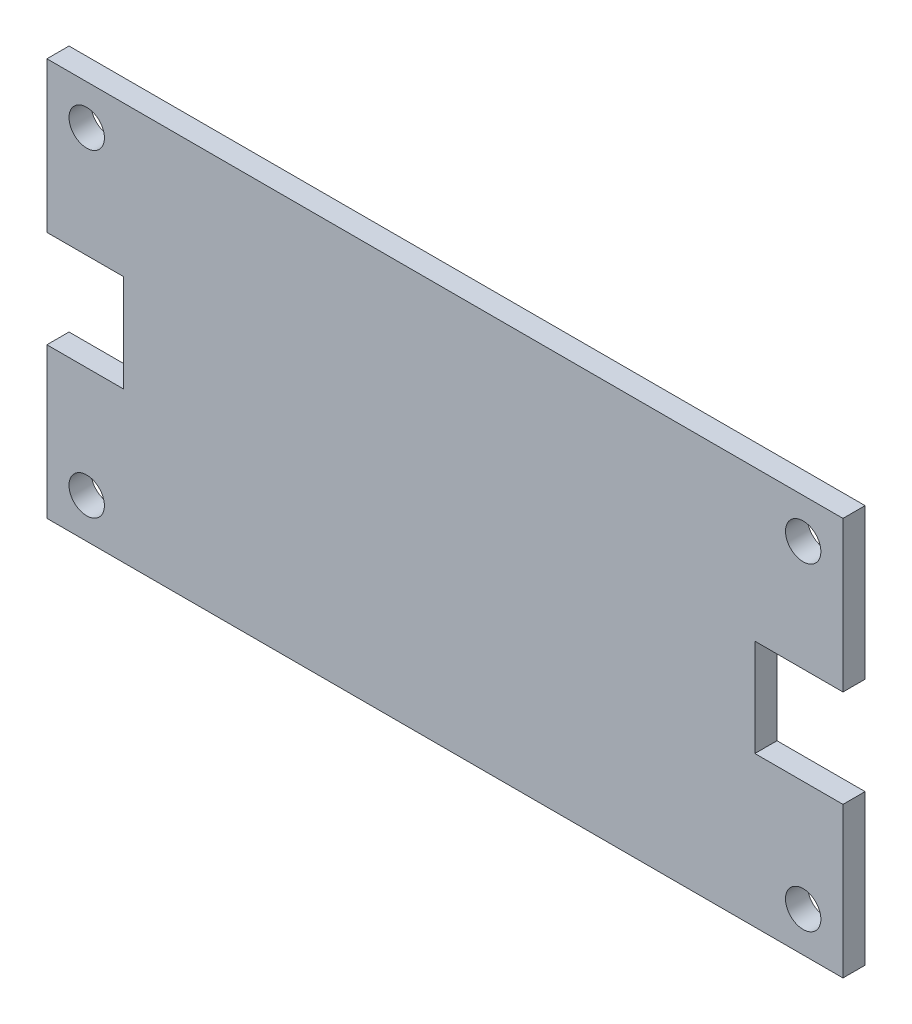
ISO-10303-21;
HEADER;
FILE_DESCRIPTION(('STEP AP214'),'2;1');
FILE_NAME('part.step','',(''),(''),'','','');
FILE_SCHEMA(('AUTOMOTIVE_DESIGN { 1 0 10303 214 1 1 1 1 }'));
ENDSEC;
DATA;
#1=APPLICATION_CONTEXT('core data for automotive mechanical design processes');
#2=APPLICATION_PROTOCOL_DEFINITION('international standard','automotive_design',2000,#1);
#3=PRODUCT_CONTEXT('',#1,'mechanical');
#4=PRODUCT('Part','Part','',(#3));
#5=PRODUCT_RELATED_PRODUCT_CATEGORY('part','',(#4));
#6=PRODUCT_DEFINITION_FORMATION('','',#4);
#7=PRODUCT_DEFINITION_CONTEXT('part definition',#1,'design');
#8=PRODUCT_DEFINITION('design','',#6,#7);
#9=PRODUCT_DEFINITION_SHAPE('','',#8);
#10=(LENGTH_UNIT() NAMED_UNIT(*) SI_UNIT(.MILLI.,.METRE.));
#11=(NAMED_UNIT(*) PLANE_ANGLE_UNIT() SI_UNIT($,.RADIAN.));
#12=(NAMED_UNIT(*) SI_UNIT($,.STERADIAN.) SOLID_ANGLE_UNIT());
#13=UNCERTAINTY_MEASURE_WITH_UNIT(LENGTH_MEASURE(1.E-05),#10,'distance_accuracy_value','');
#14=(GEOMETRIC_REPRESENTATION_CONTEXT(3) GLOBAL_UNCERTAINTY_ASSIGNED_CONTEXT((#13)) GLOBAL_UNIT_ASSIGNED_CONTEXT((#10,
#11,#12)) REPRESENTATION_CONTEXT('',''));
#15=CARTESIAN_POINT('',(0.,0.,0.));
#16=DIRECTION('',(0.,0.,1.));
#17=DIRECTION('',(1.,0.,0.));
#18=AXIS2_PLACEMENT_3D('',#15,#16,#17);
#19=CARTESIAN_POINT('',(90.,45.,5.));
#20=DIRECTION('',(-1.,0.,0.));
#21=DIRECTION('',(0.,0.,1.));
#22=AXIS2_PLACEMENT_3D('',#19,#20,#21);
#23=PLANE('',#22);
#24=DIRECTION('',(0.,1.,0.));
#25=VECTOR('',#24,1.);
#26=CARTESIAN_POINT('',(90.,45.,5.));
#27=LINE('',#26,#25);
#28=CARTESIAN_POINT('',(90.,11.,5.));
#29=VERTEX_POINT('',#28);
#30=CARTESIAN_POINT('',(90.,45.,5.));
#31=VERTEX_POINT('',#30);
#32=EDGE_CURVE('E319',#29,#31,#27,.T.);
#33=ORIENTED_EDGE('',*,*,#32,.F.);
#34=DIRECTION('',(0.,0.,-1.));
#35=VECTOR('',#34,1.);
#36=CARTESIAN_POINT('',(90.,11.,5.));
#37=LINE('',#36,#35);
#38=CARTESIAN_POINT('',(90.,11.,0.));
#39=VERTEX_POINT('',#38);
#40=EDGE_CURVE('E298',#29,#39,#37,.T.);
#41=ORIENTED_EDGE('',*,*,#40,.T.);
#42=DIRECTION('',(0.,1.,0.));
#43=VECTOR('',#42,1.);
#44=CARTESIAN_POINT('',(90.,45.,0.));
#45=LINE('',#44,#43);
#46=CARTESIAN_POINT('',(90.,45.,0.));
#47=VERTEX_POINT('',#46);
#48=EDGE_CURVE('E301',#39,#47,#45,.T.);
#49=ORIENTED_EDGE('',*,*,#48,.T.);
#50=DIRECTION('',(0.,0.,-1.));
#51=VECTOR('',#50,1.);
#52=CARTESIAN_POINT('',(90.,45.,5.));
#53=LINE('',#52,#51);
#54=EDGE_CURVE('E11',#31,#47,#53,.T.);
#55=ORIENTED_EDGE('',*,*,#54,.F.);
#56=EDGE_LOOP('',(#33,#41,#49,#55));
#57=FACE_BOUND('',#56,.T.);
#58=ADVANCED_FACE('F33',(#57),#23,.F.);
#59=CARTESIAN_POINT('',(-90.,45.,5.));
#60=DIRECTION('',(1.,0.,0.));
#61=DIRECTION('',(0.,0.,-1.));
#62=AXIS2_PLACEMENT_3D('',#59,#60,#61);
#63=PLANE('',#62);
#64=DIRECTION('',(0.,-1.,0.));
#65=VECTOR('',#64,1.);
#66=CARTESIAN_POINT('',(-90.,45.,5.));
#67=LINE('',#66,#65);
#68=CARTESIAN_POINT('',(-90.,-11.,5.));
#69=VERTEX_POINT('',#68);
#70=CARTESIAN_POINT('',(-90.,-45.,5.));
#71=VERTEX_POINT('',#70);
#72=EDGE_CURVE('E321',#69,#71,#67,.T.);
#73=ORIENTED_EDGE('',*,*,#72,.F.);
#74=DIRECTION('',(0.,0.,-1.));
#75=VECTOR('',#74,1.);
#76=CARTESIAN_POINT('',(-90.,-11.,5.));
#77=LINE('',#76,#75);
#78=CARTESIAN_POINT('',(-90.,-11.,0.));
#79=VERTEX_POINT('',#78);
#80=EDGE_CURVE('E296',#69,#79,#77,.T.);
#81=ORIENTED_EDGE('',*,*,#80,.T.);
#82=DIRECTION('',(0.,-1.,0.));
#83=VECTOR('',#82,1.);
#84=CARTESIAN_POINT('',(-90.,45.,0.));
#85=LINE('',#84,#83);
#86=CARTESIAN_POINT('',(-90.,-45.,0.));
#87=VERTEX_POINT('',#86);
#88=EDGE_CURVE('E333',#79,#87,#85,.T.);
#89=ORIENTED_EDGE('',*,*,#88,.T.);
#90=DIRECTION('',(0.,0.,-1.));
#91=VECTOR('',#90,1.);
#92=CARTESIAN_POINT('',(-90.,-45.,5.));
#93=LINE('',#92,#91);
#94=EDGE_CURVE('E341',#71,#87,#93,.T.);
#95=ORIENTED_EDGE('',*,*,#94,.F.);
#96=EDGE_LOOP('',(#73,#81,#89,#95));
#97=FACE_BOUND('',#96,.T.);
#98=ADVANCED_FACE('F395',(#97),#63,.F.);
#99=CARTESIAN_POINT('',(90.,-45.,0.));
#100=VERTEX_POINT('',#99);
#101=CARTESIAN_POINT('',(90.,-11.,0.));
#102=VERTEX_POINT('',#101);
#103=EDGE_CURVE('E328',#100,#102,#45,.T.);
#104=ORIENTED_EDGE('',*,*,#103,.T.);
#105=DIRECTION('',(0.,0.,-1.));
#106=VECTOR('',#105,1.);
#107=CARTESIAN_POINT('',(90.,-11.,5.));
#108=LINE('',#107,#106);
#109=CARTESIAN_POINT('',(90.,-11.,5.));
#110=VERTEX_POINT('',#109);
#111=EDGE_CURVE('E293',#110,#102,#108,.T.);
#112=ORIENTED_EDGE('',*,*,#111,.F.);
#113=CARTESIAN_POINT('',(90.,-45.,5.));
#114=VERTEX_POINT('',#113);
#115=EDGE_CURVE('E315',#114,#110,#27,.T.);
#116=ORIENTED_EDGE('',*,*,#115,.F.);
#117=DIRECTION('',(0.,0.,-1.));
#118=VECTOR('',#117,1.);
#119=CARTESIAN_POINT('',(90.,-45.,5.));
#120=LINE('',#119,#118);
#121=EDGE_CURVE('E327',#114,#100,#120,.T.);
#122=ORIENTED_EDGE('',*,*,#121,.T.);
#123=EDGE_LOOP('',(#104,#112,#116,#122));
#124=FACE_BOUND('',#123,.T.);
#125=ADVANCED_FACE('F35',(#124),#23,.F.);
#126=CARTESIAN_POINT('',(-90.,45.,5.));
#127=DIRECTION('',(0.,-1.,0.));
#128=DIRECTION('',(0.,0.,-1.));
#129=AXIS2_PLACEMENT_3D('',#126,#127,#128);
#130=PLANE('',#129);
#131=DIRECTION('',(-1.,0.,0.));
#132=VECTOR('',#131,1.);
#133=CARTESIAN_POINT('',(-90.,45.,0.));
#134=LINE('',#133,#132);
#135=CARTESIAN_POINT('',(-90.,45.,0.));
#136=VERTEX_POINT('',#135);
#137=EDGE_CURVE('E331',#47,#136,#134,.T.);
#138=ORIENTED_EDGE('',*,*,#137,.T.);
#139=DIRECTION('',(0.,0.,-1.));
#140=VECTOR('',#139,1.);
#141=CARTESIAN_POINT('',(-90.,45.,5.));
#142=LINE('',#141,#140);
#143=CARTESIAN_POINT('',(-90.,45.,5.));
#144=VERTEX_POINT('',#143);
#145=EDGE_CURVE('E41',#144,#136,#142,.T.);
#146=ORIENTED_EDGE('',*,*,#145,.F.);
#147=DIRECTION('',(-1.,0.,0.));
#148=VECTOR('',#147,1.);
#149=CARTESIAN_POINT('',(-90.,45.,5.));
#150=LINE('',#149,#148);
#151=EDGE_CURVE('E318',#31,#144,#150,.T.);
#152=ORIENTED_EDGE('',*,*,#151,.F.);
#153=ORIENTED_EDGE('',*,*,#54,.T.);
#154=EDGE_LOOP('',(#138,#146,#152,#153));
#155=FACE_BOUND('',#154,.T.);
#156=ADVANCED_FACE('F370',(#155),#130,.F.);
#157=CARTESIAN_POINT('',(-90.,11.,0.));
#158=VERTEX_POINT('',#157);
#159=EDGE_CURVE('E334',#136,#158,#85,.T.);
#160=ORIENTED_EDGE('',*,*,#159,.T.);
#161=DIRECTION('',(0.,0.,-1.));
#162=VECTOR('',#161,1.);
#163=CARTESIAN_POINT('',(-90.,11.,5.));
#164=LINE('',#163,#162);
#165=CARTESIAN_POINT('',(-90.,11.,5.));
#166=VERTEX_POINT('',#165);
#167=EDGE_CURVE('E309',#166,#158,#164,.T.);
#168=ORIENTED_EDGE('',*,*,#167,.F.);
#169=EDGE_CURVE('E322',#144,#166,#67,.T.);
#170=ORIENTED_EDGE('',*,*,#169,.F.);
#171=ORIENTED_EDGE('',*,*,#145,.T.);
#172=EDGE_LOOP('',(#160,#168,#170,#171));
#173=FACE_BOUND('',#172,.T.);
#174=ADVANCED_FACE('F348',(#173),#63,.F.);
#175=CARTESIAN_POINT('',(-90.,-45.,5.));
#176=DIRECTION('',(0.,1.,0.));
#177=DIRECTION('',(0.,0.,1.));
#178=AXIS2_PLACEMENT_3D('',#175,#176,#177);
#179=PLANE('',#178);
#180=DIRECTION('',(1.,0.,0.));
#181=VECTOR('',#180,1.);
#182=CARTESIAN_POINT('',(-90.,-45.,0.));
#183=LINE('',#182,#181);
#184=EDGE_CURVE('E337',#87,#100,#183,.T.);
#185=ORIENTED_EDGE('',*,*,#184,.T.);
#186=ORIENTED_EDGE('',*,*,#121,.F.);
#187=DIRECTION('',(1.,0.,0.));
#188=VECTOR('',#187,1.);
#189=CARTESIAN_POINT('',(-90.,-45.,5.));
#190=LINE('',#189,#188);
#191=EDGE_CURVE('E325',#71,#114,#190,.T.);
#192=ORIENTED_EDGE('',*,*,#191,.F.);
#193=ORIENTED_EDGE('',*,*,#94,.T.);
#194=EDGE_LOOP('',(#185,#186,#192,#193));
#195=FACE_BOUND('',#194,.T.);
#196=ADVANCED_FACE('F391',(#195),#179,.F.);
#197=CARTESIAN_POINT('',(0.,0.,5.));
#198=DIRECTION('',(0.,0.,1.));
#199=DIRECTION('',(1.,0.,0.));
#200=AXIS2_PLACEMENT_3D('',#197,#198,#199);
#201=PLANE('',#200);
#202=CARTESIAN_POINT('',(81.,-36.,5.));
#203=DIRECTION('',(0.,0.,-1.));
#204=DIRECTION('',(1.,0.,0.));
#205=AXIS2_PLACEMENT_3D('',#202,#203,#204);
#206=CIRCLE('',#205,4.00000000000001);
#207=CARTESIAN_POINT('',(85.,-36.,5.));
#208=VERTEX_POINT('',#207);
#209=EDGE_CURVE('E252',#208,#208,#206,.T.);
#210=ORIENTED_EDGE('',*,*,#209,.T.);
#211=EDGE_LOOP('',(#210));
#212=FACE_BOUND('',#211,.T.);
#213=CARTESIAN_POINT('',(-81.,-36.,5.));
#214=DIRECTION('',(0.,0.,-1.));
#215=DIRECTION('',(-1.,0.,0.));
#216=AXIS2_PLACEMENT_3D('',#213,#214,#215);
#217=CIRCLE('',#216,4.00000000000001);
#218=CARTESIAN_POINT('',(-85.,-36.,5.));
#219=VERTEX_POINT('',#218);
#220=EDGE_CURVE('E246',#219,#219,#217,.T.);
#221=ORIENTED_EDGE('',*,*,#220,.T.);
#222=EDGE_LOOP('',(#221));
#223=FACE_BOUND('',#222,.T.);
#224=CARTESIAN_POINT('',(-81.,36.,5.));
#225=DIRECTION('',(0.,0.,-1.));
#226=DIRECTION('',(1.,0.,0.));
#227=AXIS2_PLACEMENT_3D('',#224,#225,#226);
#228=CIRCLE('',#227,4.00000000000001);
#229=CARTESIAN_POINT('',(-77.,36.,5.));
#230=VERTEX_POINT('',#229);
#231=EDGE_CURVE('E239',#230,#230,#228,.T.);
#232=ORIENTED_EDGE('',*,*,#231,.T.);
#233=EDGE_LOOP('',(#232));
#234=FACE_BOUND('',#233,.T.);
#235=CARTESIAN_POINT('',(81.,36.,5.));
#236=DIRECTION('',(0.,0.,-1.));
#237=DIRECTION('',(-1.,0.,0.));
#238=AXIS2_PLACEMENT_3D('',#235,#236,#237);
#239=CIRCLE('',#238,4.00000000000001);
#240=CARTESIAN_POINT('',(77.,36.,5.));
#241=VERTEX_POINT('',#240);
#242=EDGE_CURVE('E257',#241,#241,#239,.T.);
#243=ORIENTED_EDGE('',*,*,#242,.T.);
#244=EDGE_LOOP('',(#243));
#245=FACE_BOUND('',#244,.T.);
#246=DIRECTION('',(0.,1.,0.));
#247=VECTOR('',#246,1.);
#248=CARTESIAN_POINT('',(70.0824005737011,11.,5.));
#249=LINE('',#248,#247);
#250=CARTESIAN_POINT('',(70.0824005737011,-11.,5.));
#251=VERTEX_POINT('',#250);
#252=CARTESIAN_POINT('',(70.0824005737011,11.,5.));
#253=VERTEX_POINT('',#252);
#254=EDGE_CURVE('E263',#251,#253,#249,.T.);
#255=ORIENTED_EDGE('',*,*,#254,.T.);
#256=DIRECTION('',(1.,0.,0.));
#257=VECTOR('',#256,1.);
#258=CARTESIAN_POINT('',(90.,11.,5.));
#259=LINE('',#258,#257);
#260=EDGE_CURVE('E289',#253,#29,#259,.T.);
#261=ORIENTED_EDGE('',*,*,#260,.T.);
#262=ORIENTED_EDGE('',*,*,#32,.T.);
#263=ORIENTED_EDGE('',*,*,#151,.T.);
#264=ORIENTED_EDGE('',*,*,#169,.T.);
#265=DIRECTION('',(1.,0.,0.));
#266=VECTOR('',#265,1.);
#267=CARTESIAN_POINT('',(-90.,11.,5.));
#268=LINE('',#267,#266);
#269=CARTESIAN_POINT('',(-72.7353338114177,11.,5.));
#270=VERTEX_POINT('',#269);
#271=EDGE_CURVE('E303',#166,#270,#268,.T.);
#272=ORIENTED_EDGE('',*,*,#271,.T.);
#273=DIRECTION('',(0.,-1.,0.));
#274=VECTOR('',#273,1.);
#275=CARTESIAN_POINT('',(-72.7353338114177,11.,5.));
#276=LINE('',#275,#274);
#277=CARTESIAN_POINT('',(-72.7353338114177,-11.,5.));
#278=VERTEX_POINT('',#277);
#279=EDGE_CURVE('E277',#270,#278,#276,.T.);
#280=ORIENTED_EDGE('',*,*,#279,.T.);
#281=DIRECTION('',(-1.,0.,0.));
#282=VECTOR('',#281,1.);
#283=CARTESIAN_POINT('',(-90.,-11.,5.));
#284=LINE('',#283,#282);
#285=EDGE_CURVE('E305',#278,#69,#284,.T.);
#286=ORIENTED_EDGE('',*,*,#285,.T.);
#287=ORIENTED_EDGE('',*,*,#72,.T.);
#288=ORIENTED_EDGE('',*,*,#191,.T.);
#289=ORIENTED_EDGE('',*,*,#115,.T.);
#290=DIRECTION('',(-1.,0.,0.));
#291=VECTOR('',#290,1.);
#292=CARTESIAN_POINT('',(90.,-11.,5.));
#293=LINE('',#292,#291);
#294=EDGE_CURVE('E287',#110,#251,#293,.T.);
#295=ORIENTED_EDGE('',*,*,#294,.T.);
#296=EDGE_LOOP('',(#255,#261,#262,#263,#264,#272,#280,#286,#287,#288,#289,#295));
#297=FACE_BOUND('',#296,.T.);
#298=ADVANCED_FACE('F366',(#212,#223,#234,#245,#297),#201,.T.);
#299=CARTESIAN_POINT('',(0.,0.,0.));
#300=DIRECTION('',(0.,0.,1.));
#301=DIRECTION('',(1.,0.,0.));
#302=AXIS2_PLACEMENT_3D('',#299,#300,#301);
#303=PLANE('',#302);
#304=DIRECTION('',(-1.,0.,0.));
#305=VECTOR('',#304,1.);
#306=CARTESIAN_POINT('',(-51.,-24.,0.));
#307=LINE('',#306,#305);
#308=CARTESIAN_POINT('',(-5.,-24.,0.));
#309=VERTEX_POINT('',#308);
#310=CARTESIAN_POINT('',(-51.,-24.,0.));
#311=VERTEX_POINT('',#310);
#312=EDGE_CURVE('E199',#309,#311,#307,.T.);
#313=ORIENTED_EDGE('',*,*,#312,.F.);
#314=DIRECTION('',(0.,-1.,0.));
#315=VECTOR('',#314,1.);
#316=CARTESIAN_POINT('',(-5.,-24.,0.));
#317=LINE('',#316,#315);
#318=CARTESIAN_POINT('',(-5.,24.,0.));
#319=VERTEX_POINT('',#318);
#320=EDGE_CURVE('E48',#319,#309,#317,.T.);
#321=ORIENTED_EDGE('',*,*,#320,.F.);
#322=DIRECTION('',(1.,0.,0.));
#323=VECTOR('',#322,1.);
#324=CARTESIAN_POINT('',(-51.,24.,0.));
#325=LINE('',#324,#323);
#326=CARTESIAN_POINT('',(-51.,24.,0.));
#327=VERTEX_POINT('',#326);
#328=EDGE_CURVE('E190',#327,#319,#325,.T.);
#329=ORIENTED_EDGE('',*,*,#328,.F.);
#330=DIRECTION('',(0.,1.,0.));
#331=VECTOR('',#330,1.);
#332=CARTESIAN_POINT('',(-51.,-24.,0.));
#333=LINE('',#332,#331);
#334=EDGE_CURVE('E193',#311,#327,#333,.T.);
#335=ORIENTED_EDGE('',*,*,#334,.F.);
#336=EDGE_LOOP('',(#313,#321,#329,#335));
#337=FACE_BOUND('',#336,.T.);
#338=DIRECTION('',(1.,0.,0.));
#339=VECTOR('',#338,1.);
#340=CARTESIAN_POINT('',(50.,40.,0.));
#341=LINE('',#340,#339);
#342=CARTESIAN_POINT('',(4.99999999999997,40.,0.));
#343=VERTEX_POINT('',#342);
#344=CARTESIAN_POINT('',(50.,40.,0.));
#345=VERTEX_POINT('',#344);
#346=EDGE_CURVE('E223',#343,#345,#341,.T.);
#347=ORIENTED_EDGE('',*,*,#346,.F.);
#348=DIRECTION('',(0.,1.,0.));
#349=VECTOR('',#348,1.);
#350=CARTESIAN_POINT('',(4.99999999999997,-40.,0.));
#351=LINE('',#350,#349);
#352=CARTESIAN_POINT('',(4.99999999999997,-40.,0.));
#353=VERTEX_POINT('',#352);
#354=EDGE_CURVE('E56',#353,#343,#351,.T.);
#355=ORIENTED_EDGE('',*,*,#354,.F.);
#356=DIRECTION('',(-1.,0.,0.));
#357=VECTOR('',#356,1.);
#358=CARTESIAN_POINT('',(50.,-40.,0.));
#359=LINE('',#358,#357);
#360=CARTESIAN_POINT('',(50.,-40.,0.));
#361=VERTEX_POINT('',#360);
#362=EDGE_CURVE('E212',#361,#353,#359,.T.);
#363=ORIENTED_EDGE('',*,*,#362,.F.);
#364=DIRECTION('',(0.,-1.,0.));
#365=VECTOR('',#364,1.);
#366=CARTESIAN_POINT('',(50.,-40.,0.));
#367=LINE('',#366,#365);
#368=EDGE_CURVE('E226',#345,#361,#367,.T.);
#369=ORIENTED_EDGE('',*,*,#368,.F.);
#370=EDGE_LOOP('',(#347,#355,#363,#369));
#371=FACE_BOUND('',#370,.T.);
#372=CARTESIAN_POINT('',(81.,-36.,0.));
#373=DIRECTION('',(0.,0.,-1.));
#374=DIRECTION('',(1.,0.,0.));
#375=AXIS2_PLACEMENT_3D('',#372,#373,#374);
#376=CIRCLE('',#375,4.00000000000001);
#377=CARTESIAN_POINT('',(85.,-36.,0.));
#378=VERTEX_POINT('',#377);
#379=EDGE_CURVE('E233',#378,#378,#376,.T.);
#380=ORIENTED_EDGE('',*,*,#379,.F.);
#381=EDGE_LOOP('',(#380));
#382=FACE_BOUND('',#381,.T.);
#383=CARTESIAN_POINT('',(-81.,-36.,0.));
#384=DIRECTION('',(0.,0.,-1.));
#385=DIRECTION('',(-1.,0.,0.));
#386=AXIS2_PLACEMENT_3D('',#383,#384,#385);
#387=CIRCLE('',#386,4.00000000000001);
#388=CARTESIAN_POINT('',(-85.,-36.,0.));
#389=VERTEX_POINT('',#388);
#390=EDGE_CURVE('E249',#389,#389,#387,.T.);
#391=ORIENTED_EDGE('',*,*,#390,.F.);
#392=EDGE_LOOP('',(#391));
#393=FACE_BOUND('',#392,.T.);
#394=CARTESIAN_POINT('',(-81.,36.,0.));
#395=DIRECTION('',(0.,0.,-1.));
#396=DIRECTION('',(1.,0.,0.));
#397=AXIS2_PLACEMENT_3D('',#394,#395,#396);
#398=CIRCLE('',#397,4.00000000000001);
#399=CARTESIAN_POINT('',(-77.,36.,0.));
#400=VERTEX_POINT('',#399);
#401=EDGE_CURVE('E243',#400,#400,#398,.T.);
#402=ORIENTED_EDGE('',*,*,#401,.F.);
#403=EDGE_LOOP('',(#402));
#404=FACE_BOUND('',#403,.T.);
#405=CARTESIAN_POINT('',(81.,36.,0.));
#406=DIRECTION('',(0.,0.,-1.));
#407=DIRECTION('',(-1.,0.,0.));
#408=AXIS2_PLACEMENT_3D('',#405,#406,#407);
#409=CIRCLE('',#408,4.00000000000001);
#410=CARTESIAN_POINT('',(77.,36.,0.));
#411=VERTEX_POINT('',#410);
#412=EDGE_CURVE('E242',#411,#411,#409,.T.);
#413=ORIENTED_EDGE('',*,*,#412,.F.);
#414=EDGE_LOOP('',(#413));
#415=FACE_BOUND('',#414,.T.);
#416=DIRECTION('',(1.,0.,0.));
#417=VECTOR('',#416,1.);
#418=CARTESIAN_POINT('',(90.,11.,0.));
#419=LINE('',#418,#417);
#420=CARTESIAN_POINT('',(70.0824005737011,11.,0.));
#421=VERTEX_POINT('',#420);
#422=EDGE_CURVE('E290',#421,#39,#419,.T.);
#423=ORIENTED_EDGE('',*,*,#422,.F.);
#424=DIRECTION('',(0.,1.,0.));
#425=VECTOR('',#424,1.);
#426=CARTESIAN_POINT('',(70.0824005737011,11.,0.));
#427=LINE('',#426,#425);
#428=CARTESIAN_POINT('',(70.0824005737011,-11.,0.));
#429=VERTEX_POINT('',#428);
#430=EDGE_CURVE('E267',#429,#421,#427,.T.);
#431=ORIENTED_EDGE('',*,*,#430,.F.);
#432=DIRECTION('',(-1.,0.,0.));
#433=VECTOR('',#432,1.);
#434=CARTESIAN_POINT('',(90.,-11.,0.));
#435=LINE('',#434,#433);
#436=EDGE_CURVE('E294',#102,#429,#435,.T.);
#437=ORIENTED_EDGE('',*,*,#436,.F.);
#438=ORIENTED_EDGE('',*,*,#103,.F.);
#439=ORIENTED_EDGE('',*,*,#184,.F.);
#440=ORIENTED_EDGE('',*,*,#88,.F.);
#441=DIRECTION('',(-1.,0.,0.));
#442=VECTOR('',#441,1.);
#443=CARTESIAN_POINT('',(-90.,-11.,0.));
#444=LINE('',#443,#442);
#445=CARTESIAN_POINT('',(-72.7353338114177,-11.,0.));
#446=VERTEX_POINT('',#445);
#447=EDGE_CURVE('E306',#446,#79,#444,.T.);
#448=ORIENTED_EDGE('',*,*,#447,.F.);
#449=DIRECTION('',(0.,-1.,0.));
#450=VECTOR('',#449,1.);
#451=CARTESIAN_POINT('',(-72.7353338114177,11.,0.));
#452=LINE('',#451,#450);
#453=CARTESIAN_POINT('',(-72.7353338114177,11.,0.));
#454=VERTEX_POINT('',#453);
#455=EDGE_CURVE('E260',#454,#446,#452,.T.);
#456=ORIENTED_EDGE('',*,*,#455,.F.);
#457=DIRECTION('',(1.,0.,0.));
#458=VECTOR('',#457,1.);
#459=CARTESIAN_POINT('',(-90.,11.,0.));
#460=LINE('',#459,#458);
#461=EDGE_CURVE('E274',#158,#454,#460,.T.);
#462=ORIENTED_EDGE('',*,*,#461,.F.);
#463=ORIENTED_EDGE('',*,*,#159,.F.);
#464=ORIENTED_EDGE('',*,*,#137,.F.);
#465=ORIENTED_EDGE('',*,*,#48,.F.);
#466=EDGE_LOOP('',(#423,#431,#437,#438,#439,#440,#448,#456,#462,#463,#464,#465));
#467=FACE_BOUND('',#466,.T.);
#468=ADVANCED_FACE('F355',(#337,#371,#382,#393,#404,#415,#467),#303,.F.);
#469=CARTESIAN_POINT('',(-90.,-11.,5.));
#470=DIRECTION('',(0.,-1.,0.));
#471=DIRECTION('',(1.,0.,0.));
#472=AXIS2_PLACEMENT_3D('',#469,#470,#471);
#473=PLANE('',#472);
#474=ORIENTED_EDGE('',*,*,#447,.T.);
#475=ORIENTED_EDGE('',*,*,#80,.F.);
#476=ORIENTED_EDGE('',*,*,#285,.F.);
#477=DIRECTION('',(0.,0.,-1.));
#478=VECTOR('',#477,1.);
#479=CARTESIAN_POINT('',(-72.7353338114177,-11.,5.));
#480=LINE('',#479,#478);
#481=EDGE_CURVE('E270',#278,#446,#480,.T.);
#482=ORIENTED_EDGE('',*,*,#481,.T.);
#483=EDGE_LOOP('',(#474,#475,#476,#482));
#484=FACE_BOUND('',#483,.T.);
#485=ADVANCED_FACE('F397',(#484),#473,.F.);
#486=CARTESIAN_POINT('',(-90.,11.,5.));
#487=DIRECTION('',(0.,1.,0.));
#488=DIRECTION('',(-1.,0.,0.));
#489=AXIS2_PLACEMENT_3D('',#486,#487,#488);
#490=PLANE('',#489);
#491=ORIENTED_EDGE('',*,*,#461,.T.);
#492=DIRECTION('',(0.,0.,-1.));
#493=VECTOR('',#492,1.);
#494=CARTESIAN_POINT('',(-72.7353338114177,11.,5.));
#495=LINE('',#494,#493);
#496=EDGE_CURVE('E280',#270,#454,#495,.T.);
#497=ORIENTED_EDGE('',*,*,#496,.F.);
#498=ORIENTED_EDGE('',*,*,#271,.F.);
#499=ORIENTED_EDGE('',*,*,#167,.T.);
#500=EDGE_LOOP('',(#491,#497,#498,#499));
#501=FACE_BOUND('',#500,.T.);
#502=ADVANCED_FACE('F360',(#501),#490,.F.);
#503=CARTESIAN_POINT('',(90.,11.,5.));
#504=DIRECTION('',(0.,1.,0.));
#505=DIRECTION('',(0.,0.,1.));
#506=AXIS2_PLACEMENT_3D('',#503,#504,#505);
#507=PLANE('',#506);
#508=ORIENTED_EDGE('',*,*,#422,.T.);
#509=ORIENTED_EDGE('',*,*,#40,.F.);
#510=ORIENTED_EDGE('',*,*,#260,.F.);
#511=DIRECTION('',(0.,0.,-1.));
#512=VECTOR('',#511,1.);
#513=CARTESIAN_POINT('',(70.0824005737011,11.,5.));
#514=LINE('',#513,#512);
#515=EDGE_CURVE('E271',#253,#421,#514,.T.);
#516=ORIENTED_EDGE('',*,*,#515,.T.);
#517=EDGE_LOOP('',(#508,#509,#510,#516));
#518=FACE_BOUND('',#517,.T.);
#519=ADVANCED_FACE('F376',(#518),#507,.F.);
#520=CARTESIAN_POINT('',(90.,-11.,5.));
#521=DIRECTION('',(0.,-1.,0.));
#522=DIRECTION('',(0.,0.,-1.));
#523=AXIS2_PLACEMENT_3D('',#520,#521,#522);
#524=PLANE('',#523);
#525=ORIENTED_EDGE('',*,*,#436,.T.);
#526=DIRECTION('',(0.,0.,-1.));
#527=VECTOR('',#526,1.);
#528=CARTESIAN_POINT('',(70.0824005737011,-11.,5.));
#529=LINE('',#528,#527);
#530=EDGE_CURVE('E266',#251,#429,#529,.T.);
#531=ORIENTED_EDGE('',*,*,#530,.F.);
#532=ORIENTED_EDGE('',*,*,#294,.F.);
#533=ORIENTED_EDGE('',*,*,#111,.T.);
#534=EDGE_LOOP('',(#525,#531,#532,#533));
#535=FACE_BOUND('',#534,.T.);
#536=ADVANCED_FACE('F382',(#535),#524,.F.);
#537=CARTESIAN_POINT('',(70.0824005737011,11.,5.));
#538=DIRECTION('',(-1.,0.,0.));
#539=DIRECTION('',(0.,0.,1.));
#540=AXIS2_PLACEMENT_3D('',#537,#538,#539);
#541=PLANE('',#540);
#542=ORIENTED_EDGE('',*,*,#430,.T.);
#543=ORIENTED_EDGE('',*,*,#515,.F.);
#544=ORIENTED_EDGE('',*,*,#254,.F.);
#545=ORIENTED_EDGE('',*,*,#530,.T.);
#546=EDGE_LOOP('',(#542,#543,#544,#545));
#547=FACE_BOUND('',#546,.T.);
#548=ADVANCED_FACE('F379',(#547),#541,.F.);
#549=CARTESIAN_POINT('',(-72.7353338114177,11.,5.));
#550=DIRECTION('',(1.,0.,0.));
#551=DIRECTION('',(0.,0.,-1.));
#552=AXIS2_PLACEMENT_3D('',#549,#550,#551);
#553=PLANE('',#552);
#554=ORIENTED_EDGE('',*,*,#455,.T.);
#555=ORIENTED_EDGE('',*,*,#481,.F.);
#556=ORIENTED_EDGE('',*,*,#279,.F.);
#557=ORIENTED_EDGE('',*,*,#496,.T.);
#558=EDGE_LOOP('',(#554,#555,#556,#557));
#559=FACE_BOUND('',#558,.T.);
#560=ADVANCED_FACE('F363',(#559),#553,.F.);
#561=CARTESIAN_POINT('',(81.,36.,5.));
#562=DIRECTION('',(0.,0.,-1.));
#563=DIRECTION('',(-1.,0.,0.));
#564=AXIS2_PLACEMENT_3D('',#561,#562,#563);
#565=CYLINDRICAL_SURFACE('',#564,4.00000000000001);
#566=ORIENTED_EDGE('',*,*,#242,.F.);
#567=EDGE_LOOP('',(#566));
#568=FACE_BOUND('',#567,.T.);
#569=ORIENTED_EDGE('',*,*,#412,.T.);
#570=EDGE_LOOP('',(#569));
#571=FACE_BOUND('',#570,.T.);
#572=ADVANCED_FACE('F435',(#568,#571),#565,.F.);
#573=CARTESIAN_POINT('',(-81.,36.,5.));
#574=DIRECTION('',(0.,0.,-1.));
#575=DIRECTION('',(-1.,0.,0.));
#576=AXIS2_PLACEMENT_3D('',#573,#574,#575);
#577=CYLINDRICAL_SURFACE('',#576,4.00000000000001);
#578=ORIENTED_EDGE('',*,*,#231,.F.);
#579=EDGE_LOOP('',(#578));
#580=FACE_BOUND('',#579,.T.);
#581=ORIENTED_EDGE('',*,*,#401,.T.);
#582=EDGE_LOOP('',(#581));
#583=FACE_BOUND('',#582,.T.);
#584=ADVANCED_FACE('F438',(#580,#583),#577,.F.);
#585=CARTESIAN_POINT('',(-81.,-36.,5.));
#586=DIRECTION('',(0.,0.,-1.));
#587=DIRECTION('',(-1.,0.,0.));
#588=AXIS2_PLACEMENT_3D('',#585,#586,#587);
#589=CYLINDRICAL_SURFACE('',#588,4.00000000000001);
#590=ORIENTED_EDGE('',*,*,#220,.F.);
#591=EDGE_LOOP('',(#590));
#592=FACE_BOUND('',#591,.T.);
#593=ORIENTED_EDGE('',*,*,#390,.T.);
#594=EDGE_LOOP('',(#593));
#595=FACE_BOUND('',#594,.T.);
#596=ADVANCED_FACE('F446',(#592,#595),#589,.F.);
#597=CARTESIAN_POINT('',(81.,-36.,5.));
#598=DIRECTION('',(0.,0.,-1.));
#599=DIRECTION('',(-1.,0.,0.));
#600=AXIS2_PLACEMENT_3D('',#597,#598,#599);
#601=CYLINDRICAL_SURFACE('',#600,4.00000000000001);
#602=ORIENTED_EDGE('',*,*,#209,.F.);
#603=EDGE_LOOP('',(#602));
#604=FACE_BOUND('',#603,.T.);
#605=ORIENTED_EDGE('',*,*,#379,.T.);
#606=EDGE_LOOP('',(#605));
#607=FACE_BOUND('',#606,.T.);
#608=ADVANCED_FACE('F452',(#604,#607),#601,.F.);
#609=CARTESIAN_POINT('',(4.99999999999997,-40.,3.));
#610=DIRECTION('',(-1.,0.,0.));
#611=DIRECTION('',(0.,0.,1.));
#612=AXIS2_PLACEMENT_3D('',#609,#610,#611);
#613=PLANE('',#612);
#614=ORIENTED_EDGE('',*,*,#354,.T.);
#615=DIRECTION('',(0.,0.,-1.));
#616=VECTOR('',#615,1.);
#617=CARTESIAN_POINT('',(4.99999999999997,40.,3.));
#618=LINE('',#617,#616);
#619=CARTESIAN_POINT('',(4.99999999999997,40.,3.));
#620=VERTEX_POINT('',#619);
#621=EDGE_CURVE('E221',#620,#343,#618,.T.);
#622=ORIENTED_EDGE('',*,*,#621,.F.);
#623=DIRECTION('',(0.,1.,0.));
#624=VECTOR('',#623,1.);
#625=CARTESIAN_POINT('',(4.99999999999997,-40.,3.));
#626=LINE('',#625,#624);
#627=CARTESIAN_POINT('',(4.99999999999997,-40.,3.));
#628=VERTEX_POINT('',#627);
#629=EDGE_CURVE('E208',#628,#620,#626,.T.);
#630=ORIENTED_EDGE('',*,*,#629,.F.);
#631=DIRECTION('',(0.,0.,-1.));
#632=VECTOR('',#631,1.);
#633=CARTESIAN_POINT('',(4.99999999999997,-40.,3.));
#634=LINE('',#633,#632);
#635=EDGE_CURVE('E231',#628,#353,#634,.T.);
#636=ORIENTED_EDGE('',*,*,#635,.T.);
#637=EDGE_LOOP('',(#614,#622,#630,#636));
#638=FACE_BOUND('',#637,.T.);
#639=ADVANCED_FACE('F503',(#638),#613,.F.);
#640=CARTESIAN_POINT('',(50.,-40.,3.));
#641=DIRECTION('',(0.,-1.,0.));
#642=DIRECTION('',(0.,0.,-1.));
#643=AXIS2_PLACEMENT_3D('',#640,#641,#642);
#644=PLANE('',#643);
#645=ORIENTED_EDGE('',*,*,#362,.T.);
#646=ORIENTED_EDGE('',*,*,#635,.F.);
#647=DIRECTION('',(-1.,0.,0.));
#648=VECTOR('',#647,1.);
#649=CARTESIAN_POINT('',(50.,-40.,3.));
#650=LINE('',#649,#648);
#651=CARTESIAN_POINT('',(50.,-40.,3.));
#652=VERTEX_POINT('',#651);
#653=EDGE_CURVE('E218',#652,#628,#650,.T.);
#654=ORIENTED_EDGE('',*,*,#653,.F.);
#655=DIRECTION('',(0.,0.,-1.));
#656=VECTOR('',#655,1.);
#657=CARTESIAN_POINT('',(50.,-40.,3.));
#658=LINE('',#657,#656);
#659=EDGE_CURVE('E234',#652,#361,#658,.T.);
#660=ORIENTED_EDGE('',*,*,#659,.T.);
#661=EDGE_LOOP('',(#645,#646,#654,#660));
#662=FACE_BOUND('',#661,.T.);
#663=ADVANCED_FACE('F512',(#662),#644,.F.);
#664=CARTESIAN_POINT('',(50.,-40.,3.));
#665=DIRECTION('',(1.,0.,0.));
#666=DIRECTION('',(0.,0.,-1.));
#667=AXIS2_PLACEMENT_3D('',#664,#665,#666);
#668=PLANE('',#667);
#669=ORIENTED_EDGE('',*,*,#368,.T.);
#670=ORIENTED_EDGE('',*,*,#659,.F.);
#671=DIRECTION('',(0.,-1.,0.));
#672=VECTOR('',#671,1.);
#673=CARTESIAN_POINT('',(50.,-40.,3.));
#674=LINE('',#673,#672);
#675=CARTESIAN_POINT('',(50.,40.,3.));
#676=VERTEX_POINT('',#675);
#677=EDGE_CURVE('E215',#676,#652,#674,.T.);
#678=ORIENTED_EDGE('',*,*,#677,.F.);
#679=DIRECTION('',(0.,0.,-1.));
#680=VECTOR('',#679,1.);
#681=CARTESIAN_POINT('',(50.,40.,3.));
#682=LINE('',#681,#680);
#683=EDGE_CURVE('E236',#676,#345,#682,.T.);
#684=ORIENTED_EDGE('',*,*,#683,.T.);
#685=EDGE_LOOP('',(#669,#670,#678,#684));
#686=FACE_BOUND('',#685,.T.);
#687=ADVANCED_FACE('F521',(#686),#668,.F.);
#688=CARTESIAN_POINT('',(50.,40.,3.));
#689=DIRECTION('',(0.,1.,0.));
#690=DIRECTION('',(0.,0.,1.));
#691=AXIS2_PLACEMENT_3D('',#688,#689,#690);
#692=PLANE('',#691);
#693=ORIENTED_EDGE('',*,*,#346,.T.);
#694=ORIENTED_EDGE('',*,*,#683,.F.);
#695=DIRECTION('',(1.,0.,0.));
#696=VECTOR('',#695,1.);
#697=CARTESIAN_POINT('',(50.,40.,3.));
#698=LINE('',#697,#696);
#699=EDGE_CURVE('E211',#620,#676,#698,.T.);
#700=ORIENTED_EDGE('',*,*,#699,.F.);
#701=ORIENTED_EDGE('',*,*,#621,.T.);
#702=EDGE_LOOP('',(#693,#694,#700,#701));
#703=FACE_BOUND('',#702,.T.);
#704=ADVANCED_FACE('F531',(#703),#692,.F.);
#705=CARTESIAN_POINT('',(0.,0.,3.));
#706=DIRECTION('',(0.,0.,1.));
#707=DIRECTION('',(1.,0.,0.));
#708=AXIS2_PLACEMENT_3D('',#705,#706,#707);
#709=PLANE('',#708);
#710=ORIENTED_EDGE('',*,*,#629,.T.);
#711=ORIENTED_EDGE('',*,*,#699,.T.);
#712=ORIENTED_EDGE('',*,*,#677,.T.);
#713=ORIENTED_EDGE('',*,*,#653,.T.);
#714=EDGE_LOOP('',(#710,#711,#712,#713));
#715=FACE_BOUND('',#714,.T.);
#716=ADVANCED_FACE('F541',(#715),#709,.F.);
#717=CARTESIAN_POINT('',(-5.,-24.,3.));
#718=DIRECTION('',(1.,0.,0.));
#719=DIRECTION('',(0.,1.,0.));
#720=AXIS2_PLACEMENT_3D('',#717,#718,#719);
#721=PLANE('',#720);
#722=ORIENTED_EDGE('',*,*,#320,.T.);
#723=DIRECTION('',(0.,0.,-1.));
#724=VECTOR('',#723,1.);
#725=CARTESIAN_POINT('',(-5.,-24.,3.));
#726=LINE('',#725,#724);
#727=CARTESIAN_POINT('',(-5.,-24.,3.));
#728=VERTEX_POINT('',#727);
#729=EDGE_CURVE('E168',#728,#309,#726,.T.);
#730=ORIENTED_EDGE('',*,*,#729,.F.);
#731=DIRECTION('',(0.,-1.,0.));
#732=VECTOR('',#731,1.);
#733=CARTESIAN_POINT('',(-5.,-24.,3.));
#734=LINE('',#733,#732);
#735=CARTESIAN_POINT('',(-5.,24.,3.));
#736=VERTEX_POINT('',#735);
#737=EDGE_CURVE('E172',#736,#728,#734,.T.);
#738=ORIENTED_EDGE('',*,*,#737,.F.);
#739=DIRECTION('',(0.,0.,-1.));
#740=VECTOR('',#739,1.);
#741=CARTESIAN_POINT('',(-5.,24.,3.));
#742=LINE('',#741,#740);
#743=EDGE_CURVE('E203',#736,#319,#742,.T.);
#744=ORIENTED_EDGE('',*,*,#743,.T.);
#745=EDGE_LOOP('',(#722,#730,#738,#744));
#746=FACE_BOUND('',#745,.T.);
#747=ADVANCED_FACE('F170',(#746),#721,.F.);
#748=CARTESIAN_POINT('',(-51.,24.,3.));
#749=DIRECTION('',(0.,1.,0.));
#750=DIRECTION('',(-1.,0.,0.));
#751=AXIS2_PLACEMENT_3D('',#748,#749,#750);
#752=PLANE('',#751);
#753=ORIENTED_EDGE('',*,*,#328,.T.);
#754=ORIENTED_EDGE('',*,*,#743,.F.);
#755=DIRECTION('',(1.,0.,0.));
#756=VECTOR('',#755,1.);
#757=CARTESIAN_POINT('',(-51.,24.,3.));
#758=LINE('',#757,#756);
#759=CARTESIAN_POINT('',(-51.,24.,3.));
#760=VERTEX_POINT('',#759);
#761=EDGE_CURVE('E178',#760,#736,#758,.T.);
#762=ORIENTED_EDGE('',*,*,#761,.F.);
#763=DIRECTION('',(0.,0.,-1.));
#764=VECTOR('',#763,1.);
#765=CARTESIAN_POINT('',(-51.,24.,3.));
#766=LINE('',#765,#764);
#767=EDGE_CURVE('E205',#760,#327,#766,.T.);
#768=ORIENTED_EDGE('',*,*,#767,.T.);
#769=EDGE_LOOP('',(#753,#754,#762,#768));
#770=FACE_BOUND('',#769,.T.);
#771=ADVANCED_FACE('F566',(#770),#752,.F.);
#772=CARTESIAN_POINT('',(-51.,-24.,3.));
#773=DIRECTION('',(-1.,0.,0.));
#774=DIRECTION('',(0.,0.,1.));
#775=AXIS2_PLACEMENT_3D('',#772,#773,#774);
#776=PLANE('',#775);
#777=ORIENTED_EDGE('',*,*,#334,.T.);
#778=ORIENTED_EDGE('',*,*,#767,.F.);
#779=DIRECTION('',(0.,1.,0.));
#780=VECTOR('',#779,1.);
#781=CARTESIAN_POINT('',(-51.,-24.,3.));
#782=LINE('',#781,#780);
#783=CARTESIAN_POINT('',(-51.,-24.,3.));
#784=VERTEX_POINT('',#783);
#785=EDGE_CURVE('E186',#784,#760,#782,.T.);
#786=ORIENTED_EDGE('',*,*,#785,.F.);
#787=DIRECTION('',(0.,0.,-1.));
#788=VECTOR('',#787,1.);
#789=CARTESIAN_POINT('',(-51.,-24.,3.));
#790=LINE('',#789,#788);
#791=EDGE_CURVE('E177',#784,#311,#790,.T.);
#792=ORIENTED_EDGE('',*,*,#791,.T.);
#793=EDGE_LOOP('',(#777,#778,#786,#792));
#794=FACE_BOUND('',#793,.T.);
#795=ADVANCED_FACE('F575',(#794),#776,.F.);
#796=CARTESIAN_POINT('',(-51.,-24.,3.));
#797=DIRECTION('',(0.,-1.,0.));
#798=DIRECTION('',(1.,0.,0.));
#799=AXIS2_PLACEMENT_3D('',#796,#797,#798);
#800=PLANE('',#799);
#801=ORIENTED_EDGE('',*,*,#312,.T.);
#802=ORIENTED_EDGE('',*,*,#791,.F.);
#803=DIRECTION('',(-1.,0.,0.));
#804=VECTOR('',#803,1.);
#805=CARTESIAN_POINT('',(-51.,-24.,3.));
#806=LINE('',#805,#804);
#807=EDGE_CURVE('E181',#728,#784,#806,.T.);
#808=ORIENTED_EDGE('',*,*,#807,.F.);
#809=ORIENTED_EDGE('',*,*,#729,.T.);
#810=EDGE_LOOP('',(#801,#802,#808,#809));
#811=FACE_BOUND('',#810,.T.);
#812=ADVANCED_FACE('F182',(#811),#800,.F.);
#813=CARTESIAN_POINT('',(0.,0.,3.));
#814=DIRECTION('',(0.,0.,-1.));
#815=DIRECTION('',(-1.,0.,0.));
#816=AXIS2_PLACEMENT_3D('',#813,#814,#815);
#817=PLANE('',#816);
#818=ORIENTED_EDGE('',*,*,#737,.T.);
#819=ORIENTED_EDGE('',*,*,#807,.T.);
#820=ORIENTED_EDGE('',*,*,#785,.T.);
#821=ORIENTED_EDGE('',*,*,#761,.T.);
#822=EDGE_LOOP('',(#818,#819,#820,#821));
#823=FACE_BOUND('',#822,.T.);
#824=ADVANCED_FACE('F188',(#823),#817,.T.);
#825=CLOSED_SHELL('',(#58,#98,#125,#156,#174,#196,#298,#468,#485,#502,#519,#536,#548,#560,#572,
#584,#596,#608,#639,#663,#687,#704,#716,#747,#771,#795,#812,#824));
#826=MANIFOLD_SOLID_BREP('B2',#825);
#827=ADVANCED_BREP_SHAPE_REPRESENTATION('',(#18,#826),#14);
#828=SHAPE_DEFINITION_REPRESENTATION(#9,#827);
ENDSEC;
END-ISO-10303-21;
